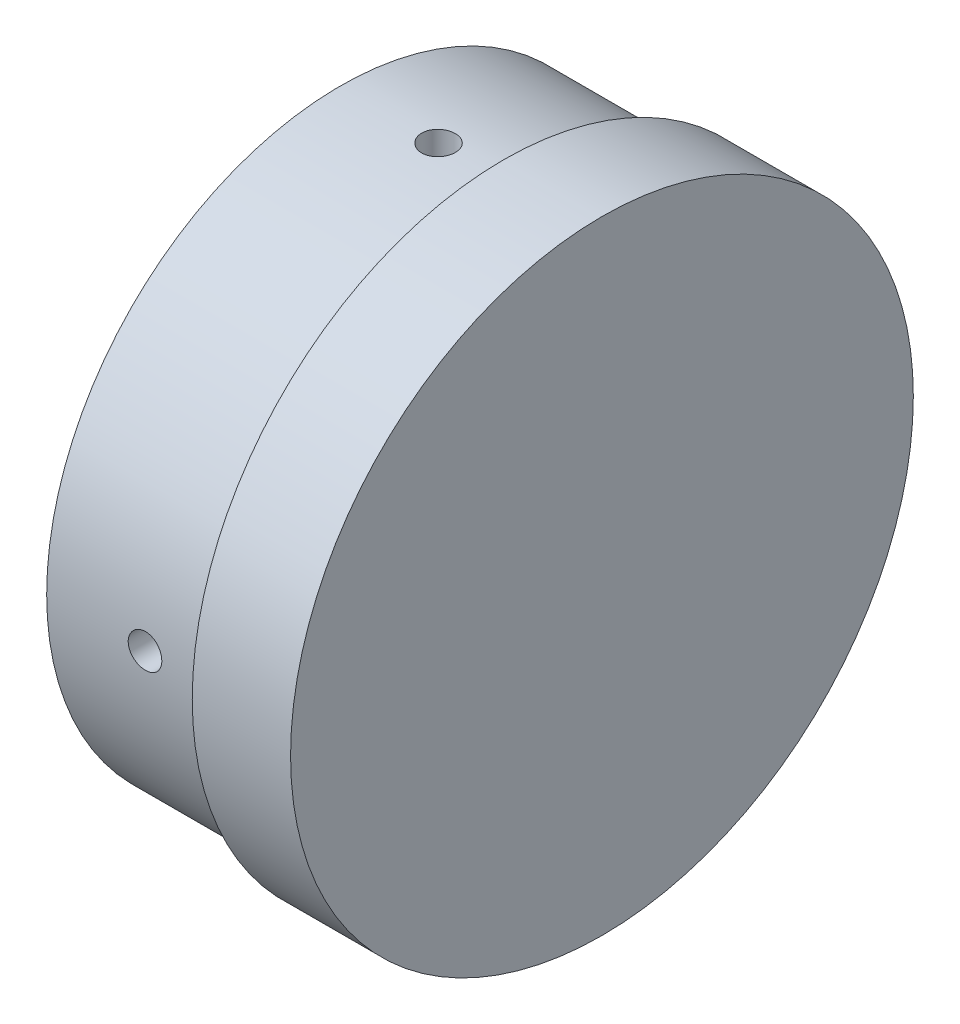
ISO-10303-21;
HEADER;
FILE_DESCRIPTION(('STEP AP214'),'2;1');
FILE_NAME('part.step','',(''),(''),'','','');
FILE_SCHEMA(('AUTOMOTIVE_DESIGN { 1 0 10303 214 1 1 1 1 }'));
ENDSEC;
DATA;
#1=APPLICATION_CONTEXT('core data for automotive mechanical design processes');
#2=APPLICATION_PROTOCOL_DEFINITION('international standard','automotive_design',2000,#1);
#3=PRODUCT_CONTEXT('',#1,'mechanical');
#4=PRODUCT('Part','Part','',(#3));
#5=PRODUCT_RELATED_PRODUCT_CATEGORY('part','',(#4));
#6=PRODUCT_DEFINITION_FORMATION('','',#4);
#7=PRODUCT_DEFINITION_CONTEXT('part definition',#1,'design');
#8=PRODUCT_DEFINITION('design','',#6,#7);
#9=PRODUCT_DEFINITION_SHAPE('','',#8);
#10=(LENGTH_UNIT() NAMED_UNIT(*) SI_UNIT(.MILLI.,.METRE.));
#11=(NAMED_UNIT(*) PLANE_ANGLE_UNIT() SI_UNIT($,.RADIAN.));
#12=(NAMED_UNIT(*) SI_UNIT($,.STERADIAN.) SOLID_ANGLE_UNIT());
#13=UNCERTAINTY_MEASURE_WITH_UNIT(LENGTH_MEASURE(1.E-05),#10,'distance_accuracy_value','');
#14=(GEOMETRIC_REPRESENTATION_CONTEXT(3) GLOBAL_UNCERTAINTY_ASSIGNED_CONTEXT((#13)) GLOBAL_UNIT_ASSIGNED_CONTEXT((#10,
#11,#12)) REPRESENTATION_CONTEXT('',''));
#15=CARTESIAN_POINT('',(0.,0.,0.));
#16=DIRECTION('',(0.,0.,1.));
#17=DIRECTION('',(1.,0.,0.));
#18=AXIS2_PLACEMENT_3D('',#15,#16,#17);
#19=CARTESIAN_POINT('',(0.,0.,0.));
#20=DIRECTION('',(1.,0.,0.));
#21=DIRECTION('',(0.,0.,-1.));
#22=AXIS2_PLACEMENT_3D('',#19,#20,#21);
#23=PLANE('',#22);
#24=CARTESIAN_POINT('',(0.,0.,0.));
#25=DIRECTION('',(-1.,0.,0.));
#26=DIRECTION('',(0.,0.,1.));
#27=AXIS2_PLACEMENT_3D('',#24,#25,#26);
#28=CIRCLE('',#27,17.9125345995124);
#29=CARTESIAN_POINT('',(0.,0.,17.9125345995124));
#30=VERTEX_POINT('',#29);
#31=EDGE_CURVE('E136',#30,#30,#28,.T.);
#32=ORIENTED_EDGE('',*,*,#31,.T.);
#33=EDGE_LOOP('',(#32));
#34=FACE_BOUND('',#33,.T.);
#35=ADVANCED_FACE('F84',(#34),#23,.F.);
#36=CARTESIAN_POINT('',(15.97,0.,0.));
#37=DIRECTION('',(1.,0.,0.));
#38=DIRECTION('',(0.,0.,-1.));
#39=AXIS2_PLACEMENT_3D('',#36,#37,#38);
#40=PLANE('',#39);
#41=CARTESIAN_POINT('',(15.97,0.,0.));
#42=DIRECTION('',(-1.,0.,0.));
#43=DIRECTION('',(0.,0.,1.));
#44=AXIS2_PLACEMENT_3D('',#41,#42,#43);
#45=CIRCLE('',#44,19.);
#46=CARTESIAN_POINT('',(15.97,0.,19.));
#47=VERTEX_POINT('',#46);
#48=EDGE_CURVE('E148',#47,#47,#45,.T.);
#49=ORIENTED_EDGE('',*,*,#48,.F.);
#50=EDGE_LOOP('',(#49));
#51=FACE_BOUND('',#50,.T.);
#52=ADVANCED_FACE('F184',(#51),#40,.T.);
#53=CARTESIAN_POINT('',(-76.2426906100627,0.,0.));
#54=DIRECTION('',(-1.,0.,0.));
#55=DIRECTION('',(0.,0.,1.));
#56=AXIS2_PLACEMENT_3D('',#53,#54,#55);
#57=CYLINDRICAL_SURFACE('',#56,19.);
#58=ORIENTED_EDGE('',*,*,#48,.T.);
#59=EDGE_LOOP('',(#58));
#60=FACE_BOUND('',#59,.T.);
#61=CARTESIAN_POINT('',(9.97000000000001,0.,0.));
#62=DIRECTION('',(-1.,0.,0.));
#63=DIRECTION('',(0.,0.,1.));
#64=AXIS2_PLACEMENT_3D('',#61,#62,#63);
#65=CIRCLE('',#64,19.);
#66=CARTESIAN_POINT('',(9.97000000000001,0.,19.));
#67=VERTEX_POINT('',#66);
#68=EDGE_CURVE('E144',#67,#67,#65,.T.);
#69=ORIENTED_EDGE('',*,*,#68,.F.);
#70=EDGE_LOOP('',(#69));
#71=FACE_BOUND('',#70,.T.);
#72=ADVANCED_FACE('F189',(#60,#71),#57,.T.);
#73=CARTESIAN_POINT('',(9.97,0.,0.));
#74=DIRECTION('',(-1.,0.,0.));
#75=DIRECTION('',(0.,0.,1.));
#76=AXIS2_PLACEMENT_3D('',#73,#74,#75);
#77=PLANE('',#76);
#78=ORIENTED_EDGE('',*,*,#68,.T.);
#79=EDGE_LOOP('',(#78));
#80=FACE_BOUND('',#79,.T.);
#81=CARTESIAN_POINT('',(9.96999999999999,0.,0.));
#82=DIRECTION('',(-1.,0.,0.));
#83=DIRECTION('',(0.,0.,1.));
#84=AXIS2_PLACEMENT_3D('',#81,#82,#83);
#85=CIRCLE('',#84,17.9125345995124);
#86=CARTESIAN_POINT('',(9.96999999999999,0.,17.9125345995124));
#87=VERTEX_POINT('',#86);
#88=EDGE_CURVE('E140',#87,#87,#85,.T.);
#89=ORIENTED_EDGE('',*,*,#88,.F.);
#90=EDGE_LOOP('',(#89));
#91=FACE_BOUND('',#90,.T.);
#92=ADVANCED_FACE('F180',(#80,#91),#77,.T.);
#93=CARTESIAN_POINT('',(-76.2426906100627,0.,0.));
#94=DIRECTION('',(-1.,0.,0.));
#95=DIRECTION('',(0.,0.,1.));
#96=AXIS2_PLACEMENT_3D('',#93,#94,#95);
#97=CYLINDRICAL_SURFACE('',#96,17.9125345995124);
#98=CARTESIAN_POINT('',(6.,1.02499999999999,-17.8831840223918));
#99=CARTESIAN_POINT('',(6.05752410886517,1.02499746534869,-17.8831844157775));
#100=CARTESIAN_POINT('',(6.11508872816398,1.02014125810967,-17.8834645596549));
#101=CARTESIAN_POINT('',(6.22862913547817,1.00083821803904,-17.8845550262148));
#102=CARTESIAN_POINT('',(6.28460298390839,0.986380160528264,-17.885365969392));
#103=CARTESIAN_POINT('',(6.39330072447486,0.948289466188904,-17.8874258779389));
#104=CARTESIAN_POINT('',(6.44602628923314,0.924661597659544,-17.888674615623));
#105=CARTESIAN_POINT('',(6.54674891827468,0.868909529244971,-17.8914691198321));
#106=CARTESIAN_POINT('',(6.59474707674855,0.836787301810026,-17.8930148173783));
#107=CARTESIAN_POINT('',(6.68472797539976,0.764912918180947,-17.8962313260255));
#108=CARTESIAN_POINT('',(6.72670386914256,0.725152196335253,-17.8979022762873));
#109=CARTESIAN_POINT('',(6.80339019037977,0.639146953054448,-17.9011797084327));
#110=CARTESIAN_POINT('',(6.83810031775384,0.592902163919613,-17.902786187651));
#111=CARTESIAN_POINT('',(6.89928993583146,0.495204038683432,-17.9057548047291));
#112=CARTESIAN_POINT('',(6.92576390325857,0.443747237862653,-17.9071167783625));
#113=CARTESIAN_POINT('',(6.96969430528376,0.337110098448307,-17.9094414724794));
#114=CARTESIAN_POINT('',(6.9871508236896,0.281929794466202,-17.9104041966735));
#115=CARTESIAN_POINT('',(7.01253219282049,0.169476715850094,-17.9118209615292));
#116=CARTESIAN_POINT('',(7.02046756354257,0.112206322829937,-17.9122755635812));
#117=CARTESIAN_POINT('',(7.02661385934716,-0.00285529146418089,-17.9126267456628));
#118=CARTESIAN_POINT('',(7.0248248791836,-0.0606465076577716,-17.9125233311296));
#119=CARTESIAN_POINT('',(7.01158195572375,-0.175038042470749,-17.9117706034315));
#120=CARTESIAN_POINT('',(7.00013933153984,-0.23163967627497,-17.9111219295985));
#121=CARTESIAN_POINT('',(6.96793149104821,-0.342117447670375,-17.9093524653345));
#122=CARTESIAN_POINT('',(6.94716622679283,-0.395993571242288,-17.9082316724753));
#123=CARTESIAN_POINT('',(6.89688969843678,-0.49952736419285,-17.9056430882056));
#124=CARTESIAN_POINT('',(6.86737329229831,-0.549182531267863,-17.9041750928871));
#125=CARTESIAN_POINT('',(6.80043608926701,-0.642837546903613,-17.901057363415));
#126=CARTESIAN_POINT('',(6.76301521830351,-0.686837342463141,-17.8994076275586));
#127=CARTESIAN_POINT('',(6.68126737121036,-0.767998664898669,-17.8961093448414));
#128=CARTESIAN_POINT('',(6.63693057247899,-0.80515029911324,-17.8944608030748));
#129=CARTESIAN_POINT('',(6.54264388390034,-0.871484455941471,-17.8913531322869));
#130=CARTESIAN_POINT('',(6.49269399218121,-0.900666975897597,-17.8898940033288));
#131=CARTESIAN_POINT('',(6.38859286546785,-0.950233743897439,-17.8873298917788));
#132=CARTESIAN_POINT('',(6.33444144121641,-0.970617595335096,-17.8862249251516));
#133=CARTESIAN_POINT('',(6.22347720811289,-1.00200167374143,-17.884494334308));
#134=CARTESIAN_POINT('',(6.1666644254923,-1.01300199317773,-17.8838687053681));
#135=CARTESIAN_POINT('',(6.05207642147427,-1.02529446428084,-17.8831682234043));
#136=CARTESIAN_POINT('',(5.99430267881315,-1.0266003579723,-17.8830925907539));
#137=CARTESIAN_POINT('',(5.87935693097593,-1.01950279333789,-17.8834985945199));
#138=CARTESIAN_POINT('',(5.82218492318318,-1.01109937725089,-17.883980228512));
#139=CARTESIAN_POINT('',(5.71010429180471,-0.984833142396414,-17.8854457732353));
#140=CARTESIAN_POINT('',(5.6551941843823,-0.966976635033694,-17.8864293488269));
#141=CARTESIAN_POINT('',(5.54915029028233,-0.922317488443175,-17.888787643305));
#142=CARTESIAN_POINT('',(5.49801653230252,-0.895514781238692,-17.8901623651636));
#143=CARTESIAN_POINT('',(5.40091366872866,-0.833688879986184,-17.8931499159257));
#144=CARTESIAN_POINT('',(5.35495044074622,-0.79865646769908,-17.8947630110782));
#145=CARTESIAN_POINT('',(5.26955253487556,-0.721379037125543,-17.8980445790165));
#146=CARTESIAN_POINT('',(5.23011791093394,-0.679133959245887,-17.8997130522597));
#147=CARTESIAN_POINT('',(5.15885030636658,-0.588571290205361,-17.9029196234121));
#148=CARTESIAN_POINT('',(5.12702621105266,-0.540246700636015,-17.9044575675905));
#149=CARTESIAN_POINT('',(5.07194380687879,-0.438932038762785,-17.9072275660692));
#150=CARTESIAN_POINT('',(5.04868545214346,-0.385941991447488,-17.9084596220077));
#151=CARTESIAN_POINT('',(5.01141024096515,-0.276833446677189,-17.9104782717611));
#152=CARTESIAN_POINT('',(4.99738773381068,-0.220716884937522,-17.911265137912));
#153=CARTESIAN_POINT('',(4.97896376723323,-0.106921257948403,-17.9123058225939));
#154=CARTESIAN_POINT('',(4.97456223130135,-0.0492422051280501,-17.9125596453639));
#155=CARTESIAN_POINT('',(4.97550587860231,0.0659530586600088,-17.9125056563015));
#156=CARTESIAN_POINT('',(4.98083714253549,0.123469384545685,-17.9121986465396));
#157=CARTESIAN_POINT('',(5.00106623258247,0.236788873707626,-17.9110591213187));
#158=CARTESIAN_POINT('',(5.01596407609992,0.29259203386708,-17.9102266049035));
#159=CARTESIAN_POINT('',(5.05490040659816,0.400903572380161,-17.9081296800941));
#160=CARTESIAN_POINT('',(5.07893889453821,0.453411950388015,-17.9068652716544));
#161=CARTESIAN_POINT('',(5.13547204354478,0.553648972279975,-17.904046632603));
#162=CARTESIAN_POINT('',(5.16796646723576,0.601377750285226,-17.9024924101274));
#163=CARTESIAN_POINT('',(5.24053997568716,0.690770950110037,-17.8992664134913));
#164=CARTESIAN_POINT('',(5.28062899569187,0.732427300235609,-17.8975944871716));
#165=CARTESIAN_POINT('',(5.36724276229318,0.808432595112012,-17.8943226715983));
#166=CARTESIAN_POINT('',(5.41376908523334,0.842779744767442,-17.8927228001168));
#167=CARTESIAN_POINT('',(5.51198243911782,0.903212872586961,-17.8897742187196));
#168=CARTESIAN_POINT('',(5.56367516080573,0.929289606081775,-17.8884257905558));
#169=CARTESIAN_POINT('',(5.6706747348685,0.972362289192639,-17.8861364457732));
#170=CARTESIAN_POINT('',(5.72597725169598,0.989368915159857,-17.8851950502877));
#171=CARTESIAN_POINT('',(5.81801707828766,1.0093801257468,-17.884074027571));
#172=CARTESIAN_POINT('',(5.8541588825366,1.01523004745372,-17.883741758267));
#173=CARTESIAN_POINT('',(5.92686166512275,1.02304078819412,-17.8832966307338));
#174=CARTESIAN_POINT('',(5.96342264297929,1.02500161168677,-17.883183772253));
#175=CARTESIAN_POINT('',(6.,1.02499999999999,-17.8831840223918));
#176=B_SPLINE_CURVE_WITH_KNOTS('',3,(#98,#99,#100,#101,#102,#103,#104,#105,#106,#107,#108,#109,
#110,#111,#112,#113,#114,#115,#116,#117,#118,#119,#120,#121,#122,#123,#124,#125,#126,#127,#128,
#129,#130,#131,#132,#133,#134,#135,#136,#137,#138,#139,#140,#141,#142,#143,#144,#145,#146,#147,
#148,#149,#150,#151,#152,#153,#154,#155,#156,#157,#158,#159,#160,#161,#162,#163,#164,#165,#166,
#167,#168,#169,#170,#171,#172,#173,#174,#175),.UNSPECIFIED.,.T.,.F.,(4,2,2,2,2,2,2,2,2,2,2,2,2,
2,2,2,2,2,2,2,2,2,2,2,2,2,2,2,2,2,2,2,2,2,2,2,2,2,4),(0.,0.172438800390304,0.345079539498288,
0.517630625495648,0.690141679039697,0.862847324224204,1.03556010179532,1.20838845437931,
1.38121520067533,1.55385081286034,1.72648474288984,1.89891653666594,2.07134921729346,
2.24388341821881,2.41641923598833,2.58920237362377,2.76198556887868,2.93477655164228,
3.10756583166145,3.2801101328828,3.45265368347899,3.62508217950854,3.79751198574626,
3.97013586243819,4.1427611654698,4.31558703567609,4.48841198026868,4.66113108797941,
4.83384882217004,5.00631973870673,5.17879096900586,5.35126221740501,5.52372862470297,
5.69642223021356,5.86915819940546,6.04208657781218,6.21481095182073,6.32445824445063,
6.43410541136081),.UNSPECIFIED.);
#177=CARTESIAN_POINT('',(6.,1.02499999999999,-17.8831840223918));
#178=VERTEX_POINT('',#177);
#179=EDGE_CURVE('E14',#178,#178,#176,.T.);
#180=ORIENTED_EDGE('',*,*,#179,.F.);
#181=EDGE_LOOP('',(#180));
#182=FACE_BOUND('',#181,.T.);
#183=CARTESIAN_POINT('',(6.,17.8831840223918,1.02499999999999));
#184=CARTESIAN_POINT('',(6.05752410886517,17.8831844157775,1.02499746534869));
#185=CARTESIAN_POINT('',(6.11508872816398,17.8834645596549,1.02014125810967));
#186=CARTESIAN_POINT('',(6.22862913547817,17.8845550262148,1.00083821803904));
#187=CARTESIAN_POINT('',(6.28460298390839,17.885365969392,0.986380160528264));
#188=CARTESIAN_POINT('',(6.39330072447486,17.8874258779389,0.948289466188904));
#189=CARTESIAN_POINT('',(6.44602628923314,17.888674615623,0.924661597659544));
#190=CARTESIAN_POINT('',(6.54674891827468,17.8914691198321,0.868909529244971));
#191=CARTESIAN_POINT('',(6.59474707674855,17.8930148173783,0.836787301810026));
#192=CARTESIAN_POINT('',(6.68472797539976,17.8962313260255,0.764912918180947));
#193=CARTESIAN_POINT('',(6.72670386914256,17.8979022762873,0.725152196335253));
#194=CARTESIAN_POINT('',(6.80339019037977,17.9011797084327,0.639146953054448));
#195=CARTESIAN_POINT('',(6.83810031775384,17.902786187651,0.592902163919613));
#196=CARTESIAN_POINT('',(6.89928993583146,17.9057548047291,0.495204038683432));
#197=CARTESIAN_POINT('',(6.92576390325857,17.9071167783625,0.443747237862653));
#198=CARTESIAN_POINT('',(6.96969430528376,17.9094414724794,0.337110098448307));
#199=CARTESIAN_POINT('',(6.9871508236896,17.9104041966735,0.281929794466202));
#200=CARTESIAN_POINT('',(7.01253219282049,17.9118209615292,0.169476715850094));
#201=CARTESIAN_POINT('',(7.02046756354257,17.9122755635812,0.112206322829937));
#202=CARTESIAN_POINT('',(7.02661385934716,17.9126267456628,-0.00285529146418089));
#203=CARTESIAN_POINT('',(7.0248248791836,17.9125233311296,-0.0606465076577716));
#204=CARTESIAN_POINT('',(7.01158195572375,17.9117706034315,-0.175038042470749));
#205=CARTESIAN_POINT('',(7.00013933153984,17.9111219295985,-0.23163967627497));
#206=CARTESIAN_POINT('',(6.96793149104821,17.9093524653345,-0.342117447670375));
#207=CARTESIAN_POINT('',(6.94716622679283,17.9082316724753,-0.395993571242288));
#208=CARTESIAN_POINT('',(6.89688969843678,17.9056430882056,-0.49952736419285));
#209=CARTESIAN_POINT('',(6.86737329229831,17.9041750928871,-0.549182531267863));
#210=CARTESIAN_POINT('',(6.80043608926701,17.901057363415,-0.642837546903613));
#211=CARTESIAN_POINT('',(6.76301521830351,17.8994076275586,-0.686837342463141));
#212=CARTESIAN_POINT('',(6.68126737121036,17.8961093448414,-0.767998664898669));
#213=CARTESIAN_POINT('',(6.63693057247899,17.8944608030748,-0.80515029911324));
#214=CARTESIAN_POINT('',(6.54264388390034,17.8913531322869,-0.871484455941471));
#215=CARTESIAN_POINT('',(6.49269399218121,17.8898940033288,-0.900666975897597));
#216=CARTESIAN_POINT('',(6.38859286546785,17.8873298917788,-0.950233743897439));
#217=CARTESIAN_POINT('',(6.33444144121641,17.8862249251516,-0.970617595335096));
#218=CARTESIAN_POINT('',(6.22347720811289,17.884494334308,-1.00200167374143));
#219=CARTESIAN_POINT('',(6.1666644254923,17.8838687053681,-1.01300199317773));
#220=CARTESIAN_POINT('',(6.05207642147427,17.8831682234043,-1.02529446428084));
#221=CARTESIAN_POINT('',(5.99430267881315,17.8830925907539,-1.0266003579723));
#222=CARTESIAN_POINT('',(5.87935693097593,17.8834985945199,-1.01950279333789));
#223=CARTESIAN_POINT('',(5.82218492318318,17.883980228512,-1.01109937725089));
#224=CARTESIAN_POINT('',(5.71010429180471,17.8854457732353,-0.984833142396414));
#225=CARTESIAN_POINT('',(5.6551941843823,17.8864293488269,-0.966976635033694));
#226=CARTESIAN_POINT('',(5.54915029028233,17.888787643305,-0.922317488443175));
#227=CARTESIAN_POINT('',(5.49801653230252,17.8901623651636,-0.895514781238692));
#228=CARTESIAN_POINT('',(5.40091366872866,17.8931499159257,-0.833688879986184));
#229=CARTESIAN_POINT('',(5.35495044074622,17.8947630110782,-0.79865646769908));
#230=CARTESIAN_POINT('',(5.26955253487556,17.8980445790165,-0.721379037125543));
#231=CARTESIAN_POINT('',(5.23011791093394,17.8997130522597,-0.679133959245887));
#232=CARTESIAN_POINT('',(5.15885030636658,17.9029196234121,-0.588571290205361));
#233=CARTESIAN_POINT('',(5.12702621105266,17.9044575675905,-0.540246700636015));
#234=CARTESIAN_POINT('',(5.07194380687879,17.9072275660692,-0.438932038762785));
#235=CARTESIAN_POINT('',(5.04868545214346,17.9084596220077,-0.385941991447488));
#236=CARTESIAN_POINT('',(5.01141024096515,17.9104782717611,-0.276833446677189));
#237=CARTESIAN_POINT('',(4.99738773381068,17.911265137912,-0.220716884937522));
#238=CARTESIAN_POINT('',(4.97896376723323,17.9123058225939,-0.106921257948403));
#239=CARTESIAN_POINT('',(4.97456223130135,17.9125596453639,-0.0492422051280501));
#240=CARTESIAN_POINT('',(4.97550587860231,17.9125056563015,0.0659530586600088));
#241=CARTESIAN_POINT('',(4.98083714253549,17.9121986465396,0.123469384545685));
#242=CARTESIAN_POINT('',(5.00106623258247,17.9110591213187,0.236788873707626));
#243=CARTESIAN_POINT('',(5.01596407609992,17.9102266049035,0.29259203386708));
#244=CARTESIAN_POINT('',(5.05490040659816,17.9081296800941,0.400903572380161));
#245=CARTESIAN_POINT('',(5.07893889453821,17.9068652716544,0.453411950388015));
#246=CARTESIAN_POINT('',(5.13547204354478,17.904046632603,0.553648972279975));
#247=CARTESIAN_POINT('',(5.16796646723576,17.9024924101274,0.601377750285226));
#248=CARTESIAN_POINT('',(5.24053997568716,17.8992664134913,0.690770950110037));
#249=CARTESIAN_POINT('',(5.28062899569187,17.8975944871716,0.732427300235609));
#250=CARTESIAN_POINT('',(5.36724276229318,17.8943226715983,0.808432595112012));
#251=CARTESIAN_POINT('',(5.41376908523334,17.8927228001168,0.842779744767442));
#252=CARTESIAN_POINT('',(5.51198243911782,17.8897742187196,0.903212872586961));
#253=CARTESIAN_POINT('',(5.56367516080573,17.8884257905558,0.929289606081775));
#254=CARTESIAN_POINT('',(5.6706747348685,17.8861364457732,0.972362289192639));
#255=CARTESIAN_POINT('',(5.72597725169597,17.8851950502877,0.989368915159857));
#256=CARTESIAN_POINT('',(5.81801707828766,17.884074027571,1.0093801257468));
#257=CARTESIAN_POINT('',(5.8541588825366,17.883741758267,1.01523004745372));
#258=CARTESIAN_POINT('',(5.92686166512275,17.8832966307338,1.02304078819412));
#259=CARTESIAN_POINT('',(5.96342264297929,17.883183772253,1.02500161168677));
#260=CARTESIAN_POINT('',(6.,17.8831840223918,1.02499999999999));
#261=B_SPLINE_CURVE_WITH_KNOTS('',3,(#183,#184,#185,#186,#187,#188,#189,#190,#191,#192,#193,
#194,#195,#196,#197,#198,#199,#200,#201,#202,#203,#204,#205,#206,#207,#208,#209,#210,#211,#212,
#213,#214,#215,#216,#217,#218,#219,#220,#221,#222,#223,#224,#225,#226,#227,#228,#229,#230,#231,
#232,#233,#234,#235,#236,#237,#238,#239,#240,#241,#242,#243,#244,#245,#246,#247,#248,#249,#250,
#251,#252,#253,#254,#255,#256,#257,#258,#259,#260),.UNSPECIFIED.,.T.,.F.,(4,2,2,2,2,2,2,2,2,2,2,
2,2,2,2,2,2,2,2,2,2,2,2,2,2,2,2,2,2,2,2,2,2,2,2,2,2,2,4),(0.,0.172438800390304,
0.345079539498288,0.517630625495648,0.690141679039697,0.862847324224204,1.03556010179532,
1.20838845437931,1.38121520067533,1.55385081286034,1.72648474288984,1.89891653666594,
2.07134921729346,2.24388341821881,2.41641923598833,2.58920237362377,2.76198556887868,
2.93477655164228,3.10756583166145,3.2801101328828,3.45265368347899,3.62508217950854,
3.79751198574626,3.97013586243819,4.1427611654698,4.31558703567609,4.48841198026868,
4.66113108797941,4.83384882217004,5.00631973870673,5.17879096900586,5.35126221740501,
5.52372862470297,5.69642223021356,5.86915819940546,6.04208657781217,6.21481095182073,
6.32445824445063,6.43410541136081),.UNSPECIFIED.);
#262=CARTESIAN_POINT('',(6.,17.8831840223918,1.02499999999999));
#263=VERTEX_POINT('',#262);
#264=EDGE_CURVE('E97',#263,#263,#261,.T.);
#265=ORIENTED_EDGE('',*,*,#264,.F.);
#266=EDGE_LOOP('',(#265));
#267=FACE_BOUND('',#266,.T.);
#268=CARTESIAN_POINT('',(6.,-17.8831840223918,-1.02499999999999));
#269=CARTESIAN_POINT('',(6.05752410886517,-17.8831844157775,-1.02499746534869));
#270=CARTESIAN_POINT('',(6.11508872816398,-17.8834645596549,-1.02014125810967));
#271=CARTESIAN_POINT('',(6.22862913547817,-17.8845550262148,-1.00083821803904));
#272=CARTESIAN_POINT('',(6.28460298390839,-17.885365969392,-0.986380160528262));
#273=CARTESIAN_POINT('',(6.39330072447486,-17.8874258779389,-0.948289466188901));
#274=CARTESIAN_POINT('',(6.44602628923314,-17.888674615623,-0.924661597659542));
#275=CARTESIAN_POINT('',(6.54674891827468,-17.8914691198321,-0.868909529244968));
#276=CARTESIAN_POINT('',(6.59474707674855,-17.8930148173783,-0.836787301810023));
#277=CARTESIAN_POINT('',(6.68472797539976,-17.8962313260255,-0.764912918180944));
#278=CARTESIAN_POINT('',(6.72670386914256,-17.8979022762873,-0.72515219633525));
#279=CARTESIAN_POINT('',(6.80339019037977,-17.9011797084327,-0.639146953054445));
#280=CARTESIAN_POINT('',(6.83810031775384,-17.902786187651,-0.59290216391961));
#281=CARTESIAN_POINT('',(6.89928993583146,-17.9057548047291,-0.49520403868343));
#282=CARTESIAN_POINT('',(6.92576390325857,-17.9071167783625,-0.443747237862651));
#283=CARTESIAN_POINT('',(6.96969430528375,-17.9094414724794,-0.337110098448304));
#284=CARTESIAN_POINT('',(6.9871508236896,-17.9104041966735,-0.281929794466201));
#285=CARTESIAN_POINT('',(7.01253219282049,-17.9118209615292,-0.169476715850092));
#286=CARTESIAN_POINT('',(7.02046756354256,-17.9122755635812,-0.112206322829935));
#287=CARTESIAN_POINT('',(7.02661385934716,-17.9126267456628,0.00285529146418213));
#288=CARTESIAN_POINT('',(7.0248248791836,-17.9125233311296,0.0606465076577727));
#289=CARTESIAN_POINT('',(7.01158195572375,-17.9117706034315,0.17503804247075));
#290=CARTESIAN_POINT('',(7.00013933153983,-17.9111219295985,0.231639676274971));
#291=CARTESIAN_POINT('',(6.9679314910482,-17.9093524653345,0.342117447670376));
#292=CARTESIAN_POINT('',(6.94716622679282,-17.9082316724753,0.395993571242288));
#293=CARTESIAN_POINT('',(6.89688969843677,-17.9056430882056,0.49952736419285));
#294=CARTESIAN_POINT('',(6.86737329229831,-17.9041750928871,0.549182531267863));
#295=CARTESIAN_POINT('',(6.800436089267,-17.901057363415,0.642837546903612));
#296=CARTESIAN_POINT('',(6.76301521830351,-17.8994076275586,0.68683734246314));
#297=CARTESIAN_POINT('',(6.68126737121035,-17.8961093448414,0.767998664898668));
#298=CARTESIAN_POINT('',(6.63693057247899,-17.8944608030748,0.80515029911324));
#299=CARTESIAN_POINT('',(6.54264388390034,-17.8913531322869,0.87148445594147));
#300=CARTESIAN_POINT('',(6.49269399218121,-17.8898940033288,0.900666975897597));
#301=CARTESIAN_POINT('',(6.38859286546785,-17.8873298917788,0.950233743897438));
#302=CARTESIAN_POINT('',(6.33444144121641,-17.8862249251516,0.970617595335095));
#303=CARTESIAN_POINT('',(6.22347720811289,-17.884494334308,1.00200167374142));
#304=CARTESIAN_POINT('',(6.1666644254923,-17.8838687053681,1.01300199317772));
#305=CARTESIAN_POINT('',(6.05207642147427,-17.8831682234043,1.02529446428083));
#306=CARTESIAN_POINT('',(5.99430267881314,-17.8830925907539,1.0266003579723));
#307=CARTESIAN_POINT('',(5.87935693097593,-17.8834985945199,1.01950279333789));
#308=CARTESIAN_POINT('',(5.82218492318318,-17.883980228512,1.01109937725089));
#309=CARTESIAN_POINT('',(5.71010429180471,-17.8854457732353,0.984833142396412));
#310=CARTESIAN_POINT('',(5.6551941843823,-17.8864293488269,0.966976635033692));
#311=CARTESIAN_POINT('',(5.54915029028232,-17.888787643305,0.922317488443172));
#312=CARTESIAN_POINT('',(5.49801653230252,-17.8901623651636,0.895514781238689));
#313=CARTESIAN_POINT('',(5.40091366872866,-17.8931499159257,0.833688879986182));
#314=CARTESIAN_POINT('',(5.35495044074622,-17.8947630110782,0.798656467699078));
#315=CARTESIAN_POINT('',(5.26955253487556,-17.8980445790165,0.721379037125541));
#316=CARTESIAN_POINT('',(5.23011791093394,-17.8997130522597,0.679133959245885));
#317=CARTESIAN_POINT('',(5.15885030636658,-17.9029196234121,0.588571290205359));
#318=CARTESIAN_POINT('',(5.12702621105266,-17.9044575675905,0.540246700636014));
#319=CARTESIAN_POINT('',(5.07194380687879,-17.9072275660692,0.438932038762784));
#320=CARTESIAN_POINT('',(5.04868545214346,-17.9084596220077,0.385941991447486));
#321=CARTESIAN_POINT('',(5.01141024096515,-17.9104782717611,0.276833446677187));
#322=CARTESIAN_POINT('',(4.99738773381068,-17.911265137912,0.22071688493752));
#323=CARTESIAN_POINT('',(4.97896376723323,-17.9123058225939,0.106921257948401));
#324=CARTESIAN_POINT('',(4.97456223130135,-17.9125596453639,0.0492422051280487));
#325=CARTESIAN_POINT('',(4.97550587860231,-17.9125056563015,-0.0659530586600099));
#326=CARTESIAN_POINT('',(4.98083714253549,-17.9121986465396,-0.123469384545686));
#327=CARTESIAN_POINT('',(5.00106623258247,-17.9110591213187,-0.236788873707626));
#328=CARTESIAN_POINT('',(5.01596407609992,-17.9102266049035,-0.292592033867081));
#329=CARTESIAN_POINT('',(5.05490040659816,-17.9081296800941,-0.400903572380161));
#330=CARTESIAN_POINT('',(5.07893889453821,-17.9068652716544,-0.453411950388015));
#331=CARTESIAN_POINT('',(5.13547204354478,-17.904046632603,-0.553648972279974));
#332=CARTESIAN_POINT('',(5.16796646723576,-17.9024924101274,-0.601377750285225));
#333=CARTESIAN_POINT('',(5.24053997568716,-17.8992664134913,-0.690770950110036));
#334=CARTESIAN_POINT('',(5.28062899569187,-17.8975944871716,-0.732427300235608));
#335=CARTESIAN_POINT('',(5.36724276229318,-17.8943226715983,-0.808432595112011));
#336=CARTESIAN_POINT('',(5.41376908523335,-17.8927228001168,-0.84277974476744));
#337=CARTESIAN_POINT('',(5.51198243911782,-17.8897742187196,-0.903212872586959));
#338=CARTESIAN_POINT('',(5.56367516080573,-17.8884257905558,-0.929289606081774));
#339=CARTESIAN_POINT('',(5.6706747348685,-17.8861364457732,-0.972362289192637));
#340=CARTESIAN_POINT('',(5.72597725169598,-17.8851950502877,-0.989368915159855));
#341=CARTESIAN_POINT('',(5.81801707828766,-17.884074027571,-1.0093801257468));
#342=CARTESIAN_POINT('',(5.8541588825366,-17.883741758267,-1.01523004745372));
#343=CARTESIAN_POINT('',(5.92686166512275,-17.8832966307338,-1.02304078819412));
#344=CARTESIAN_POINT('',(5.96342264297929,-17.883183772253,-1.02500161168677));
#345=CARTESIAN_POINT('',(6.,-17.8831840223918,-1.02499999999999));
#346=B_SPLINE_CURVE_WITH_KNOTS('',3,(#268,#269,#270,#271,#272,#273,#274,#275,#276,#277,#278,
#279,#280,#281,#282,#283,#284,#285,#286,#287,#288,#289,#290,#291,#292,#293,#294,#295,#296,#297,
#298,#299,#300,#301,#302,#303,#304,#305,#306,#307,#308,#309,#310,#311,#312,#313,#314,#315,#316,
#317,#318,#319,#320,#321,#322,#323,#324,#325,#326,#327,#328,#329,#330,#331,#332,#333,#334,#335,
#336,#337,#338,#339,#340,#341,#342,#343,#344,#345),.UNSPECIFIED.,.T.,.F.,(4,2,2,2,2,2,2,2,2,2,2,
2,2,2,2,2,2,2,2,2,2,2,2,2,2,2,2,2,2,2,2,2,2,2,2,2,2,2,4),(0.,0.172438800390304,
0.345079539498288,0.517630625495648,0.690141679039697,0.862847324224204,1.03556010179532,
1.2083884543793,1.38121520067533,1.55385081286034,1.72648474288984,1.89891653666593,
2.07134921729345,2.24388341821881,2.41641923598833,2.58920237362377,2.76198556887868,
2.93477655164228,3.10756583166145,3.28011013288279,3.45265368347899,3.62508217950854,
3.79751198574625,3.97013586243818,4.14276116546979,4.31558703567608,4.48841198026867,
4.6611310879794,4.83384882217003,5.00631973870672,5.17879096900585,5.35126221740499,
5.52372862470296,5.69642223021355,5.86915819940545,6.04208657781216,6.21481095182072,
6.32445824445062,6.43410541136079),.UNSPECIFIED.);
#347=CARTESIAN_POINT('',(6.,-17.8831840223918,-1.02499999999999));
#348=VERTEX_POINT('',#347);
#349=EDGE_CURVE('E160',#348,#348,#346,.T.);
#350=ORIENTED_EDGE('',*,*,#349,.F.);
#351=EDGE_LOOP('',(#350));
#352=FACE_BOUND('',#351,.T.);
#353=CARTESIAN_POINT('',(7.02499999999999,0.,17.9125345995124));
#354=CARTESIAN_POINT('',(7.02499746542757,0.0575241958123299,17.9125342085235));
#355=CARTESIAN_POINT('',(7.02014124400502,0.11508890176435,17.9122545349155));
#356=CARTESIAN_POINT('',(7.00083814247084,0.228629489130814,17.9111657485364));
#357=CARTESIAN_POINT('',(6.98638003797513,0.284603431027939,17.9103560161544));
#358=CARTESIAN_POINT('',(6.94828920617107,0.39330136917272,17.9082987352055));
#359=CARTESIAN_POINT('',(6.92466124492109,0.446027037250683,17.9070514141088));
#360=CARTESIAN_POINT('',(6.86890895820211,0.546749839180457,17.9042593296618));
#361=CARTESIAN_POINT('',(6.83678660541325,0.594748067353587,17.9027146353941));
#362=CARTESIAN_POINT('',(6.7649120955497,0.68472888636508,17.8994992884761));
#363=CARTESIAN_POINT('',(6.72515140079025,0.726704653069117,17.8978284961619));
#364=CARTESIAN_POINT('',(6.63914626489529,0.803390729387805,17.8945504585791));
#365=CARTESIAN_POINT('',(6.59290155571494,0.838100738492916,17.8929432159412));
#366=CARTESIAN_POINT('',(6.49520349960181,0.899290233626496,17.8899724803822));
#367=CARTESIAN_POINT('',(6.44374667420871,0.925764174453541,17.8886091519455));
#368=CARTESIAN_POINT('',(6.33710948136327,0.969694520508309,17.8862817557074));
#369=CARTESIAN_POINT('',(6.28192914865528,0.987151009865444,17.885317684181));
#370=CARTESIAN_POINT('',(6.16947598587097,1.01253231721337,17.8838988253077));
#371=CARTESIAN_POINT('',(6.11220553693078,1.02046765303064,17.8834434760239));
#372=CARTESIAN_POINT('',(5.99714381342622,1.02661385965455,17.8830917266056));
#373=CARTESIAN_POINT('',(5.93935254396203,1.02482482558462,17.8831953210035));
#374=CARTESIAN_POINT('',(5.82496124901078,1.01158181757049,17.8839492547244));
#375=CARTESIAN_POINT('',(5.76835990200879,1.00013921698034,17.8845989506543));
#376=CARTESIAN_POINT('',(5.65788269206329,0.967931523400516,17.8863708528118));
#377=CARTESIAN_POINT('',(5.60400684329313,0.94716638193656,17.8874930614963));
#378=CARTESIAN_POINT('',(5.50047338037585,0.896890106186889,17.8900842569861));
#379=CARTESIAN_POINT('',(5.45081828260371,0.867373800942815,17.8915534487148));
#380=CARTESIAN_POINT('',(5.35716336262786,0.800436812375242,17.8946728244776));
#381=CARTESIAN_POINT('',(5.31316359338094,0.763016055042717,17.8963230102062));
#382=CARTESIAN_POINT('',(5.23200213963824,0.681268287577601,17.8996212550941));
#383=CARTESIAN_POINT('',(5.19485037083059,0.636931431894607,17.9012693077913));
#384=CARTESIAN_POINT('',(5.12851596972282,0.542644581769065,17.9043752687906));
#385=CARTESIAN_POINT('',(5.09933333980924,0.492694585645539,17.9058331770359));
#386=CARTESIAN_POINT('',(5.0497664930638,0.388593432729476,17.9083946457628));
#387=CARTESIAN_POINT('',(5.02938263852195,0.334442103055101,17.9094981916531));
#388=CARTESIAN_POINT('',(4.997998524834,0.223478075212782,17.911226370952));
#389=CARTESIAN_POINT('',(4.98699817378157,0.166665403116992,17.9118510090512));
#390=CARTESIAN_POINT('',(4.97470558375769,0.0520774471912708,17.9125503772822));
#391=CARTESIAN_POINT('',(4.97339963278624,-0.00569636113415956,17.9126258841159));
#392=CARTESIAN_POINT('',(4.98049710630725,-0.120642254133897,17.9122205449928));
#393=CARTESIAN_POINT('',(4.98890048855599,-0.177814341425101,17.9117397014566));
#394=CARTESIAN_POINT('',(5.01516673587704,-0.289895351445206,17.910276304863));
#395=CARTESIAN_POINT('',(5.0330233234264,-0.344805750027391,17.9092940847665));
#396=CARTESIAN_POINT('',(5.07768272811047,-0.450850190880167,17.9069384744991));
#397=CARTESIAN_POINT('',(5.10448561275279,-0.501984204651084,17.9055650813764));
#398=CARTESIAN_POINT('',(5.16631177225135,-0.599087237375134,17.9025795899895));
#399=CARTESIAN_POINT('',(5.20134422020585,-0.64505040746742,17.9009672261017));
#400=CARTESIAN_POINT('',(5.27862168931758,-0.730448179878222,17.8976861948487));
#401=CARTESIAN_POINT('',(5.32086677034108,-0.769882728002548,17.8960175270163));
#402=CARTESIAN_POINT('',(5.41142940524001,-0.841150176040034,17.8928097254625));
#403=CARTESIAN_POINT('',(5.45975395717161,-0.872974191028976,17.891270744488));
#404=CARTESIAN_POINT('',(5.56106852304281,-0.928056454114799,17.8884982840285));
#405=CARTESIAN_POINT('',(5.61405851199722,-0.951314748080909,17.8872648029075));
#406=CARTESIAN_POINT('',(5.72316709954297,-0.988589917429088,17.8852435380061));
#407=CARTESIAN_POINT('',(5.77928377141664,-1.00261241723345,17.8844554830112));
#408=CARTESIAN_POINT('',(5.89307963008928,-1.02103633176629,17.8834131823289));
#409=CARTESIAN_POINT('',(5.9507588043643,-1.0254378235872,17.8831589323641));
#410=CARTESIAN_POINT('',(6.06595398656541,-1.02449405072705,17.8832130170796));
#411=CARTESIAN_POINT('',(6.12347010986218,-1.01916275793149,17.8835205453004));
#412=CARTESIAN_POINT('',(6.2367891868255,-0.998933681575329,17.8846618222773));
#413=CARTESIAN_POINT('',(6.29259213731022,-0.98403588024829,17.8854955720106));
#414=CARTESIAN_POINT('',(6.40090326663271,-0.945099709779008,17.8875951386087));
#415=CARTESIAN_POINT('',(6.4534114452345,-0.921061339982112,17.8888609555045));
#416=CARTESIAN_POINT('',(6.55364811783768,-0.864528488737638,17.891681970563));
#417=CARTESIAN_POINT('',(6.60137674583765,-0.832034244449325,17.8932371606094));
#418=CARTESIAN_POINT('',(6.69076996270794,-0.75946092984239,17.8964642382233));
#419=CARTESIAN_POINT('',(6.73242644682038,-0.719371883499726,17.898136277432));
#420=CARTESIAN_POINT('',(6.80843199968795,-0.632758009583373,17.9014074049284));
#421=CARTESIAN_POINT('',(6.84277927369339,-0.586231605957562,17.9030064752233));
#422=CARTESIAN_POINT('',(6.90321253138675,-0.488018189878566,17.9059528853956));
#423=CARTESIAN_POINT('',(6.92928929380004,-0.436325501062327,17.9072999436089));
#424=CARTESIAN_POINT('',(6.97236204015795,-0.329325997407643,17.909586589511));
#425=CARTESIAN_POINT('',(6.98936870000838,-0.274023517929221,17.9105266560002));
#426=CARTESIAN_POINT('',(7.00938000863205,-0.181983600275235,17.91164601222));
#427=CARTESIAN_POINT('',(7.01522997439413,-0.14584166068581,17.9119777589665));
#428=CARTESIAN_POINT('',(7.02304077368093,-0.0731386067847669,17.9124221767954));
#429=CARTESIAN_POINT('',(7.02500161164016,-0.036577492951152,17.9125348481276));
#430=CARTESIAN_POINT('',(7.02499999999999,0.,17.9125345995124));
#431=B_SPLINE_CURVE_WITH_KNOTS('',3,(#353,#354,#355,#356,#357,#358,#359,#360,#361,#362,#363,
#364,#365,#366,#367,#368,#369,#370,#371,#372,#373,#374,#375,#376,#377,#378,#379,#380,#381,#382,
#383,#384,#385,#386,#387,#388,#389,#390,#391,#392,#393,#394,#395,#396,#397,#398,#399,#400,#401,
#402,#403,#404,#405,#406,#407,#408,#409,#410,#411,#412,#413,#414,#415,#416,#417,#418,#419,#420,
#421,#422,#423,#424,#425,#426,#427,#428,#429,#430),.UNSPECIFIED.,.T.,.F.,(4,2,2,2,2,2,2,2,2,2,2,
2,2,2,2,2,2,2,2,2,2,2,2,2,2,2,2,2,2,2,2,2,2,2,2,2,2,2,4),(0.,0.172439061518908,
0.345080056051833,0.517631439863727,0.690142786645415,0.862848090218626,1.03556053542029,
1.20838901449453,1.38121588111529,1.55385165308283,1.72648573633679,1.89891671423501,
2.0713485887303,2.24388255491699,2.41641813660301,2.58920161481351,2.76198514476791,
2.93477578841438,3.10756473965085,3.28010924725677,3.45265300415277,3.62508232460297,
3.79751294621221,3.97013668764022,4.14276186194869,4.31558759445973,4.48841240147968,
4.66113186394053,4.83384994240788,5.00632027062017,5.1787909191366,5.35126158000549,
5.523727404165,5.69642135863266,5.86915766866211,6.0420859008631,6.21481013725428,
6.32445783697474,6.43410541167163),.UNSPECIFIED.);
#432=CARTESIAN_POINT('',(7.02499999999999,0.,17.9125345995124));
#433=VERTEX_POINT('',#432);
#434=EDGE_CURVE('E152',#433,#433,#431,.T.);
#435=ORIENTED_EDGE('',*,*,#434,.F.);
#436=EDGE_LOOP('',(#435));
#437=FACE_BOUND('',#436,.T.);
#438=ORIENTED_EDGE('',*,*,#88,.T.);
#439=EDGE_LOOP('',(#438));
#440=FACE_BOUND('',#439,.T.);
#441=ORIENTED_EDGE('',*,*,#31,.F.);
#442=EDGE_LOOP('',(#441));
#443=FACE_BOUND('',#442,.T.);
#444=ADVANCED_FACE('F165',(#182,#267,#352,#437,#440,#443),#97,.T.);
#445=CARTESIAN_POINT('',(6.,0.,13.9125345995124));
#446=DIRECTION('',(0.,0.,1.));
#447=DIRECTION('',(1.,0.,0.));
#448=AXIS2_PLACEMENT_3D('',#445,#446,#447);
#449=CONICAL_SURFACE('',#448,1.02499999999999,1.02974425867665);
#450=CARTESIAN_POINT('',(6.,0.,13.2966524650091));
#451=VERTEX_POINT('',#450);
#452=VERTEX_LOOP('',#451);
#453=FACE_BOUND('',#452,.T.);
#454=CARTESIAN_POINT('',(6.,0.,13.9125345995124));
#455=DIRECTION('',(0.,0.,1.));
#456=DIRECTION('',(1.,0.,0.));
#457=AXIS2_PLACEMENT_3D('',#454,#455,#456);
#458=CIRCLE('',#457,1.02499999999999);
#459=CARTESIAN_POINT('',(7.025,0.,13.9125345995124));
#460=VERTEX_POINT('',#459);
#461=EDGE_CURVE('E132',#460,#460,#458,.T.);
#462=ORIENTED_EDGE('',*,*,#461,.T.);
#463=EDGE_LOOP('',(#462));
#464=FACE_BOUND('',#463,.T.);
#465=ADVANCED_FACE('F174',(#453,#464),#449,.F.);
#466=CARTESIAN_POINT('',(6.,0.,17.9125345995124));
#467=DIRECTION('',(0.,0.,1.));
#468=DIRECTION('',(1.,0.,0.));
#469=AXIS2_PLACEMENT_3D('',#466,#467,#468);
#470=CYLINDRICAL_SURFACE('',#469,1.02499999999999);
#471=ORIENTED_EDGE('',*,*,#434,.T.);
#472=EDGE_LOOP('',(#471));
#473=FACE_BOUND('',#472,.T.);
#474=ORIENTED_EDGE('',*,*,#461,.F.);
#475=EDGE_LOOP('',(#474));
#476=FACE_BOUND('',#475,.T.);
#477=ADVANCED_FACE('F169',(#473,#476),#470,.F.);
#478=CARTESIAN_POINT('',(6.,-13.9125345995124,0.));
#479=DIRECTION('',(0.,-1.,0.));
#480=DIRECTION('',(0.,0.,-1.));
#481=AXIS2_PLACEMENT_3D('',#478,#479,#480);
#482=CONICAL_SURFACE('',#481,1.02499999999999,1.02974425867665);
#483=CARTESIAN_POINT('',(6.,-13.2966524650091,0.));
#484=VERTEX_POINT('',#483);
#485=VERTEX_LOOP('',#484);
#486=FACE_BOUND('',#485,.T.);
#487=CARTESIAN_POINT('',(6.,-13.9125345995124,0.));
#488=DIRECTION('',(0.,-1.,0.));
#489=DIRECTION('',(0.,0.,-1.));
#490=AXIS2_PLACEMENT_3D('',#487,#488,#489);
#491=CIRCLE('',#490,1.02499999999999);
#492=CARTESIAN_POINT('',(6.,-13.9125345995124,-1.02499999999999));
#493=VERTEX_POINT('',#492);
#494=EDGE_CURVE('E126',#493,#493,#491,.T.);
#495=ORIENTED_EDGE('',*,*,#494,.T.);
#496=EDGE_LOOP('',(#495));
#497=FACE_BOUND('',#496,.T.);
#498=ADVANCED_FACE('F173',(#486,#497),#482,.F.);
#499=CARTESIAN_POINT('',(6.,-17.9125345995124,0.));
#500=DIRECTION('',(0.,-1.,0.));
#501=DIRECTION('',(0.,0.,-1.));
#502=AXIS2_PLACEMENT_3D('',#499,#500,#501);
#503=CYLINDRICAL_SURFACE('',#502,1.02499999999999);
#504=ORIENTED_EDGE('',*,*,#349,.T.);
#505=EDGE_LOOP('',(#504));
#506=FACE_BOUND('',#505,.T.);
#507=ORIENTED_EDGE('',*,*,#494,.F.);
#508=EDGE_LOOP('',(#507));
#509=FACE_BOUND('',#508,.T.);
#510=ADVANCED_FACE('F235',(#506,#509),#503,.F.);
#511=CARTESIAN_POINT('',(6.,13.0125345995124,0.));
#512=DIRECTION('',(0.,1.,0.));
#513=DIRECTION('',(0.,0.,1.));
#514=AXIS2_PLACEMENT_3D('',#511,#512,#513);
#515=CONICAL_SURFACE('',#514,1.025,1.02974425867665);
#516=CARTESIAN_POINT('',(6.,12.3966524650091,0.));
#517=VERTEX_POINT('',#516);
#518=VERTEX_LOOP('',#517);
#519=FACE_BOUND('',#518,.T.);
#520=CARTESIAN_POINT('',(6.,13.0125345995124,0.));
#521=DIRECTION('',(0.,1.,0.));
#522=DIRECTION('',(0.,0.,1.));
#523=AXIS2_PLACEMENT_3D('',#520,#521,#522);
#524=CIRCLE('',#523,1.025);
#525=CARTESIAN_POINT('',(6.,13.0125345995124,1.025));
#526=VERTEX_POINT('',#525);
#527=EDGE_CURVE('E121',#526,#526,#524,.T.);
#528=ORIENTED_EDGE('',*,*,#527,.T.);
#529=EDGE_LOOP('',(#528));
#530=FACE_BOUND('',#529,.T.);
#531=ADVANCED_FACE('F243',(#519,#530),#515,.F.);
#532=CARTESIAN_POINT('',(6.,17.9125345995124,0.));
#533=DIRECTION('',(0.,1.,0.));
#534=DIRECTION('',(0.,0.,1.));
#535=AXIS2_PLACEMENT_3D('',#532,#533,#534);
#536=CYLINDRICAL_SURFACE('',#535,1.02499999999999);
#537=ORIENTED_EDGE('',*,*,#264,.T.);
#538=EDGE_LOOP('',(#537));
#539=FACE_BOUND('',#538,.T.);
#540=ORIENTED_EDGE('',*,*,#527,.F.);
#541=EDGE_LOOP('',(#540));
#542=FACE_BOUND('',#541,.T.);
#543=ADVANCED_FACE('F114',(#539,#542),#536,.F.);
#544=CARTESIAN_POINT('',(6.,0.,-13.0125345995124));
#545=DIRECTION('',(0.,0.,-1.));
#546=DIRECTION('',(0.,1.,0.));
#547=AXIS2_PLACEMENT_3D('',#544,#545,#546);
#548=CONICAL_SURFACE('',#547,1.025,1.02974425867665);
#549=CARTESIAN_POINT('',(6.,0.,-12.3966524650091));
#550=VERTEX_POINT('',#549);
#551=VERTEX_LOOP('',#550);
#552=FACE_BOUND('',#551,.T.);
#553=CARTESIAN_POINT('',(6.,0.,-13.0125345995124));
#554=DIRECTION('',(0.,0.,-1.));
#555=DIRECTION('',(0.,1.,0.));
#556=AXIS2_PLACEMENT_3D('',#553,#554,#555);
#557=CIRCLE('',#556,1.025);
#558=CARTESIAN_POINT('',(6.,1.025,-13.0125345995124));
#559=VERTEX_POINT('',#558);
#560=EDGE_CURVE('E118',#559,#559,#557,.T.);
#561=ORIENTED_EDGE('',*,*,#560,.T.);
#562=EDGE_LOOP('',(#561));
#563=FACE_BOUND('',#562,.T.);
#564=ADVANCED_FACE('F110',(#552,#563),#548,.F.);
#565=CARTESIAN_POINT('',(6.,0.,-17.9125345995124));
#566=DIRECTION('',(0.,0.,-1.));
#567=DIRECTION('',(0.,1.,0.));
#568=AXIS2_PLACEMENT_3D('',#565,#566,#567);
#569=CYLINDRICAL_SURFACE('',#568,1.02499999999999);
#570=ORIENTED_EDGE('',*,*,#179,.T.);
#571=EDGE_LOOP('',(#570));
#572=FACE_BOUND('',#571,.T.);
#573=ORIENTED_EDGE('',*,*,#560,.F.);
#574=EDGE_LOOP('',(#573));
#575=FACE_BOUND('',#574,.T.);
#576=ADVANCED_FACE('F113',(#572,#575),#569,.F.);
#577=CLOSED_SHELL('',(#35,#52,#72,#92,#444,#465,#477,#498,#510,#531,#543,#564,#576));
#578=MANIFOLD_SOLID_BREP('B2',#577);
#579=ADVANCED_BREP_SHAPE_REPRESENTATION('',(#18,#578),#14);
#580=SHAPE_DEFINITION_REPRESENTATION(#9,#579);
ENDSEC;
END-ISO-10303-21;
